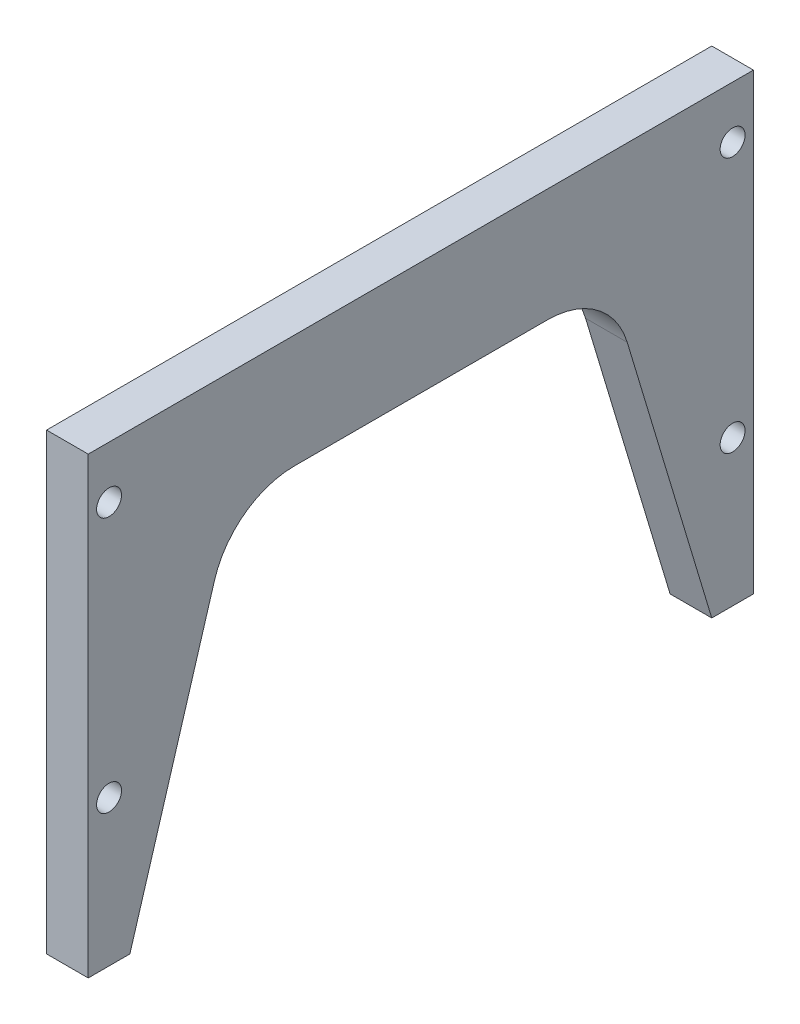
ISO-10303-21;
HEADER;
FILE_DESCRIPTION(('STEP AP214'),'2;1');
FILE_NAME('part.step','',(''),(''),'','','');
FILE_SCHEMA(('AUTOMOTIVE_DESIGN { 1 0 10303 214 1 1 1 1 }'));
ENDSEC;
DATA;
#1=APPLICATION_CONTEXT('core data for automotive mechanical design processes');
#2=APPLICATION_PROTOCOL_DEFINITION('international standard','automotive_design',2000,#1);
#3=PRODUCT_CONTEXT('',#1,'mechanical');
#4=PRODUCT('Part','Part','',(#3));
#5=PRODUCT_RELATED_PRODUCT_CATEGORY('part','',(#4));
#6=PRODUCT_DEFINITION_FORMATION('','',#4);
#7=PRODUCT_DEFINITION_CONTEXT('part definition',#1,'design');
#8=PRODUCT_DEFINITION('design','',#6,#7);
#9=PRODUCT_DEFINITION_SHAPE('','',#8);
#10=(LENGTH_UNIT() NAMED_UNIT(*) SI_UNIT(.MILLI.,.METRE.));
#11=(NAMED_UNIT(*) PLANE_ANGLE_UNIT() SI_UNIT($,.RADIAN.));
#12=(NAMED_UNIT(*) SI_UNIT($,.STERADIAN.) SOLID_ANGLE_UNIT());
#13=UNCERTAINTY_MEASURE_WITH_UNIT(LENGTH_MEASURE(1.E-05),#10,'distance_accuracy_value','');
#14=(GEOMETRIC_REPRESENTATION_CONTEXT(3) GLOBAL_UNCERTAINTY_ASSIGNED_CONTEXT((#13)) GLOBAL_UNIT_ASSIGNED_CONTEXT((#10,
#11,#12)) REPRESENTATION_CONTEXT('',''));
#15=CARTESIAN_POINT('',(0.,0.,0.));
#16=DIRECTION('',(0.,0.,1.));
#17=DIRECTION('',(1.,0.,0.));
#18=AXIS2_PLACEMENT_3D('',#15,#16,#17);
#19=CARTESIAN_POINT('',(-67.2831378268646,-15.875,0.));
#20=DIRECTION('',(0.,1.,0.));
#21=DIRECTION('',(0.,0.,1.));
#22=AXIS2_PLACEMENT_3D('',#19,#20,#21);
#23=PLANE('',#22);
#24=DIRECTION('',(0.,0.,1.));
#25=VECTOR('',#24,1.);
#26=CARTESIAN_POINT('',(-60.9331378268646,-15.875,0.));
#27=LINE('',#26,#25);
#28=CARTESIAN_POINT('',(-60.9331378268646,-15.875,-6.35));
#29=VERTEX_POINT('',#28);
#30=CARTESIAN_POINT('',(-60.9331378268646,-15.875,0.));
#31=VERTEX_POINT('',#30);
#32=EDGE_CURVE('E144',#29,#31,#27,.T.);
#33=ORIENTED_EDGE('',*,*,#32,.T.);
#34=DIRECTION('',(1.,0.,0.));
#35=VECTOR('',#34,1.);
#36=CARTESIAN_POINT('',(-67.2831378268646,-15.875,0.));
#37=LINE('',#36,#35);
#38=CARTESIAN_POINT('',(-67.2831378268646,-15.875,0.));
#39=VERTEX_POINT('',#38);
#40=EDGE_CURVE('E11',#39,#31,#37,.T.);
#41=ORIENTED_EDGE('',*,*,#40,.F.);
#42=DIRECTION('',(0.,0.,1.));
#43=VECTOR('',#42,1.);
#44=CARTESIAN_POINT('',(-67.2831378268646,-15.875,0.));
#45=LINE('',#44,#43);
#46=CARTESIAN_POINT('',(-67.2831378268646,-15.875,-6.35));
#47=VERTEX_POINT('',#46);
#48=EDGE_CURVE('E167',#47,#39,#45,.T.);
#49=ORIENTED_EDGE('',*,*,#48,.F.);
#50=DIRECTION('',(1.,0.,0.));
#51=VECTOR('',#50,1.);
#52=CARTESIAN_POINT('',(-67.2831378268646,-15.875,-6.35));
#53=LINE('',#52,#51);
#54=EDGE_CURVE('E52',#47,#29,#53,.T.);
#55=ORIENTED_EDGE('',*,*,#54,.T.);
#56=EDGE_LOOP('',(#33,#41,#49,#55));
#57=FACE_BOUND('',#56,.T.);
#58=ADVANCED_FACE('F35',(#57),#23,.F.);
#59=CARTESIAN_POINT('',(-67.2831378268646,0.,0.));
#60=DIRECTION('',(0.,0.,-1.));
#61=DIRECTION('',(-1.,0.,0.));
#62=AXIS2_PLACEMENT_3D('',#59,#60,#61);
#63=PLANE('',#62);
#64=DIRECTION('',(0.,1.,0.));
#65=VECTOR('',#64,1.);
#66=CARTESIAN_POINT('',(-60.9331378268646,0.,0.));
#67=LINE('',#66,#65);
#68=CARTESIAN_POINT('',(-60.9331378268646,53.278467801772,0.));
#69=VERTEX_POINT('',#68);
#70=EDGE_CURVE('E146',#31,#69,#67,.T.);
#71=ORIENTED_EDGE('',*,*,#70,.T.);
#72=DIRECTION('',(1.,0.,0.));
#73=VECTOR('',#72,1.);
#74=CARTESIAN_POINT('',(-67.2831378268646,53.278467801772,0.));
#75=LINE('',#74,#73);
#76=CARTESIAN_POINT('',(-67.2831378268646,53.278467801772,0.));
#77=VERTEX_POINT('',#76);
#78=EDGE_CURVE('E44',#77,#69,#75,.T.);
#79=ORIENTED_EDGE('',*,*,#78,.F.);
#80=DIRECTION('',(0.,1.,0.));
#81=VECTOR('',#80,1.);
#82=CARTESIAN_POINT('',(-67.2831378268646,0.,0.));
#83=LINE('',#82,#81);
#84=EDGE_CURVE('E97',#39,#77,#83,.T.);
#85=ORIENTED_EDGE('',*,*,#84,.F.);
#86=ORIENTED_EDGE('',*,*,#40,.T.);
#87=EDGE_LOOP('',(#71,#79,#85,#86));
#88=FACE_BOUND('',#87,.T.);
#89=ADVANCED_FACE('F226',(#88),#63,.F.);
#90=CARTESIAN_POINT('',(-67.2831378268646,53.278467801772,0.));
#91=DIRECTION('',(0.,-1.,0.));
#92=DIRECTION('',(0.,0.,-1.));
#93=AXIS2_PLACEMENT_3D('',#90,#91,#92);
#94=PLANE('',#93);
#95=DIRECTION('',(0.,0.,-1.));
#96=VECTOR('',#95,1.);
#97=CARTESIAN_POINT('',(-60.9331378268646,53.278467801772,0.));
#98=LINE('',#97,#96);
#99=CARTESIAN_POINT('',(-60.9331378268646,53.278467801772,-101.389403682228));
#100=VERTEX_POINT('',#99);
#101=EDGE_CURVE('E149',#69,#100,#98,.T.);
#102=ORIENTED_EDGE('',*,*,#101,.T.);
#103=DIRECTION('',(1.,0.,0.));
#104=VECTOR('',#103,1.);
#105=CARTESIAN_POINT('',(-67.2831378268646,53.278467801772,-101.389403682228));
#106=LINE('',#105,#104);
#107=CARTESIAN_POINT('',(-67.2831378268646,53.278467801772,-101.389403682228));
#108=VERTEX_POINT('',#107);
#109=EDGE_CURVE('E179',#108,#100,#106,.T.);
#110=ORIENTED_EDGE('',*,*,#109,.F.);
#111=DIRECTION('',(0.,0.,-1.));
#112=VECTOR('',#111,1.);
#113=CARTESIAN_POINT('',(-67.2831378268646,53.278467801772,0.));
#114=LINE('',#113,#112);
#115=EDGE_CURVE('E188',#77,#108,#114,.T.);
#116=ORIENTED_EDGE('',*,*,#115,.F.);
#117=ORIENTED_EDGE('',*,*,#78,.T.);
#118=EDGE_LOOP('',(#102,#110,#116,#117));
#119=FACE_BOUND('',#118,.T.);
#120=ADVANCED_FACE('F186',(#119),#94,.F.);
#121=CARTESIAN_POINT('',(-67.2831378268646,0.,-101.389403682228));
#122=DIRECTION('',(0.,0.,1.));
#123=DIRECTION('',(1.,0.,0.));
#124=AXIS2_PLACEMENT_3D('',#121,#122,#123);
#125=PLANE('',#124);
#126=DIRECTION('',(0.,-1.,0.));
#127=VECTOR('',#126,1.);
#128=CARTESIAN_POINT('',(-60.9331378268646,0.,-101.389403682228));
#129=LINE('',#128,#127);
#130=CARTESIAN_POINT('',(-60.9331378268646,-15.875,-101.389403682228));
#131=VERTEX_POINT('',#130);
#132=EDGE_CURVE('E151',#100,#131,#129,.T.);
#133=ORIENTED_EDGE('',*,*,#132,.T.);
#134=DIRECTION('',(1.,0.,0.));
#135=VECTOR('',#134,1.);
#136=CARTESIAN_POINT('',(-67.2831378268646,-15.875,-101.389403682228));
#137=LINE('',#136,#135);
#138=CARTESIAN_POINT('',(-67.2831378268646,-15.875,-101.389403682228));
#139=VERTEX_POINT('',#138);
#140=EDGE_CURVE('E176',#139,#131,#137,.T.);
#141=ORIENTED_EDGE('',*,*,#140,.F.);
#142=DIRECTION('',(0.,-1.,0.));
#143=VECTOR('',#142,1.);
#144=CARTESIAN_POINT('',(-67.2831378268646,0.,-101.389403682228));
#145=LINE('',#144,#143);
#146=EDGE_CURVE('E205',#108,#139,#145,.T.);
#147=ORIENTED_EDGE('',*,*,#146,.F.);
#148=ORIENTED_EDGE('',*,*,#109,.T.);
#149=EDGE_LOOP('',(#133,#141,#147,#148));
#150=FACE_BOUND('',#149,.T.);
#151=ADVANCED_FACE('F196',(#150),#125,.F.);
#152=CARTESIAN_POINT('',(-67.2831378268646,-15.875,0.));
#153=DIRECTION('',(0.,1.,0.));
#154=DIRECTION('',(0.,0.,1.));
#155=AXIS2_PLACEMENT_3D('',#152,#153,#154);
#156=PLANE('',#155);
#157=DIRECTION('',(0.,0.,1.));
#158=VECTOR('',#157,1.);
#159=CARTESIAN_POINT('',(-60.9331378268646,-15.875,0.));
#160=LINE('',#159,#158);
#161=CARTESIAN_POINT('',(-60.9331378268646,-15.875,-95.0394036822282));
#162=VERTEX_POINT('',#161);
#163=EDGE_CURVE('E153',#131,#162,#160,.T.);
#164=ORIENTED_EDGE('',*,*,#163,.T.);
#165=DIRECTION('',(1.,0.,0.));
#166=VECTOR('',#165,1.);
#167=CARTESIAN_POINT('',(-67.2831378268646,-15.875,-95.0394036822282));
#168=LINE('',#167,#166);
#169=CARTESIAN_POINT('',(-67.2831378268646,-15.875,-95.0394036822282));
#170=VERTEX_POINT('',#169);
#171=EDGE_CURVE('E173',#170,#162,#168,.T.);
#172=ORIENTED_EDGE('',*,*,#171,.F.);
#173=DIRECTION('',(0.,0.,1.));
#174=VECTOR('',#173,1.);
#175=CARTESIAN_POINT('',(-67.2831378268646,-15.875,0.));
#176=LINE('',#175,#174);
#177=EDGE_CURVE('E202',#139,#170,#176,.T.);
#178=ORIENTED_EDGE('',*,*,#177,.F.);
#179=ORIENTED_EDGE('',*,*,#140,.T.);
#180=EDGE_LOOP('',(#164,#172,#178,#179));
#181=FACE_BOUND('',#180,.T.);
#182=ADVANCED_FACE('F200',(#181),#156,.F.);
#183=CARTESIAN_POINT('',(-67.2831378268646,24.8989950156883,-82.7743549297925));
#184=DIRECTION('',(0.,0.288055621235218,-0.957613679452624));
#185=DIRECTION('',(0.,0.957613679452624,0.288055621235218));
#186=AXIS2_PLACEMENT_3D('',#183,#184,#185);
#187=PLANE('',#186);
#188=DIRECTION('',(0.,0.957613679452624,0.288055621235218));
#189=VECTOR('',#188,1.);
#190=CARTESIAN_POINT('',(-60.9331378268646,24.8989950156883,-82.7743549297925));
#191=LINE('',#190,#189);
#192=CARTESIAN_POINT('',(-60.9331378268646,26.9601430789718,-82.1543499125644));
#193=VERTEX_POINT('',#192);
#194=EDGE_CURVE('E155',#162,#193,#191,.T.);
#195=ORIENTED_EDGE('',*,*,#194,.T.);
#196=DIRECTION('',(1.,0.,0.));
#197=VECTOR('',#196,1.);
#198=CARTESIAN_POINT('',(-67.2831378268646,26.9601430789718,-82.1543499125644));
#199=LINE('',#198,#197);
#200=CARTESIAN_POINT('',(-67.2831378268646,26.9601430789718,-82.1543499125644));
#201=VERTEX_POINT('',#200);
#202=EDGE_CURVE('E171',#201,#193,#199,.T.);
#203=ORIENTED_EDGE('',*,*,#202,.F.);
#204=DIRECTION('',(0.,0.957613679452624,0.288055621235218));
#205=VECTOR('',#204,1.);
#206=CARTESIAN_POINT('',(-67.2831378268646,24.8989950156883,-82.7743549297925));
#207=LINE('',#206,#205);
#208=EDGE_CURVE('E204',#170,#201,#207,.T.);
#209=ORIENTED_EDGE('',*,*,#208,.F.);
#210=ORIENTED_EDGE('',*,*,#171,.T.);
#211=EDGE_LOOP('',(#195,#203,#209,#210));
#212=FACE_BOUND('',#211,.T.);
#213=ADVANCED_FACE('F345',(#212),#187,.F.);
#214=CARTESIAN_POINT('',(-67.2831378268646,23.3018366892845,-69.9926561835161));
#215=DIRECTION('',(1.,0.,0.));
#216=DIRECTION('',(0.,0.,-1.));
#217=AXIS2_PLACEMENT_3D('',#214,#215,#216);
#218=CYLINDRICAL_SURFACE('',#217,12.7);
#219=CARTESIAN_POINT('',(-60.9331378268646,23.3018366892845,-69.9926561835161));
#220=DIRECTION('',(-1.,0.,0.));
#221=DIRECTION('',(0.,0.,1.));
#222=AXIS2_PLACEMENT_3D('',#219,#220,#221);
#223=CIRCLE('',#222,12.7);
#224=CARTESIAN_POINT('',(-60.9331378268646,36.0018366892845,-69.9926561835161));
#225=VERTEX_POINT('',#224);
#226=EDGE_CURVE('E158',#225,#193,#223,.T.);
#227=ORIENTED_EDGE('',*,*,#226,.F.);
#228=DIRECTION('',(1.,0.,0.));
#229=VECTOR('',#228,1.);
#230=CARTESIAN_POINT('',(-67.2831378268646,36.0018366892845,-69.9926561835161));
#231=LINE('',#230,#229);
#232=CARTESIAN_POINT('',(-67.2831378268646,36.0018366892845,-69.9926561835161));
#233=VERTEX_POINT('',#232);
#234=EDGE_CURVE('E136',#233,#225,#231,.T.);
#235=ORIENTED_EDGE('',*,*,#234,.F.);
#236=CARTESIAN_POINT('',(-67.2831378268646,23.3018366892845,-69.9926561835161));
#237=DIRECTION('',(-1.,0.,0.));
#238=DIRECTION('',(0.,0.,1.));
#239=AXIS2_PLACEMENT_3D('',#236,#237,#238);
#240=CIRCLE('',#239,12.7);
#241=EDGE_CURVE('E126',#233,#201,#240,.T.);
#242=ORIENTED_EDGE('',*,*,#241,.T.);
#243=ORIENTED_EDGE('',*,*,#202,.T.);
#244=EDGE_LOOP('',(#227,#235,#242,#243));
#245=FACE_BOUND('',#244,.T.);
#246=ADVANCED_FACE('F212',(#245),#218,.F.);
#247=CARTESIAN_POINT('',(-67.2831378268646,36.0018366892845,0.));
#248=DIRECTION('',(0.,1.,0.));
#249=DIRECTION('',(0.,0.,1.));
#250=AXIS2_PLACEMENT_3D('',#247,#248,#249);
#251=PLANE('',#250);
#252=DIRECTION('',(0.,0.,1.));
#253=VECTOR('',#252,1.);
#254=CARTESIAN_POINT('',(-60.9331378268646,36.0018366892845,0.));
#255=LINE('',#254,#253);
#256=CARTESIAN_POINT('',(-60.9331378268646,36.0018366892845,-31.3967474987121));
#257=VERTEX_POINT('',#256);
#258=EDGE_CURVE('E133',#225,#257,#255,.T.);
#259=ORIENTED_EDGE('',*,*,#258,.T.);
#260=DIRECTION('',(1.,0.,0.));
#261=VECTOR('',#260,1.);
#262=CARTESIAN_POINT('',(-67.2831378268646,36.0018366892845,-31.3967474987121));
#263=LINE('',#262,#261);
#264=CARTESIAN_POINT('',(-67.2831378268646,36.0018366892845,-31.3967474987121));
#265=VERTEX_POINT('',#264);
#266=EDGE_CURVE('E130',#265,#257,#263,.T.);
#267=ORIENTED_EDGE('',*,*,#266,.F.);
#268=DIRECTION('',(0.,0.,1.));
#269=VECTOR('',#268,1.);
#270=CARTESIAN_POINT('',(-67.2831378268646,36.0018366892845,0.));
#271=LINE('',#270,#269);
#272=EDGE_CURVE('E119',#233,#265,#271,.T.);
#273=ORIENTED_EDGE('',*,*,#272,.F.);
#274=ORIENTED_EDGE('',*,*,#234,.T.);
#275=EDGE_LOOP('',(#259,#267,#273,#274));
#276=FACE_BOUND('',#275,.T.);
#277=ADVANCED_FACE('F131',(#276),#251,.F.);
#278=CARTESIAN_POINT('',(-67.2831378268646,23.3018366892845,-31.3967474987121));
#279=DIRECTION('',(1.,0.,0.));
#280=DIRECTION('',(0.,0.,-1.));
#281=AXIS2_PLACEMENT_3D('',#278,#279,#280);
#282=CYLINDRICAL_SURFACE('',#281,12.7);
#283=CARTESIAN_POINT('',(-60.9331378268646,23.3018366892845,-31.3967474987121));
#284=DIRECTION('',(-1.,0.,0.));
#285=DIRECTION('',(0.,0.,1.));
#286=AXIS2_PLACEMENT_3D('',#283,#284,#285);
#287=CIRCLE('',#286,12.7);
#288=CARTESIAN_POINT('',(-60.9331378268646,26.9601430789718,-19.2350537696638));
#289=VERTEX_POINT('',#288);
#290=EDGE_CURVE('E162',#257,#289,#287,.F.);
#291=ORIENTED_EDGE('',*,*,#290,.T.);
#292=DIRECTION('',(1.,0.,0.));
#293=VECTOR('',#292,1.);
#294=CARTESIAN_POINT('',(-67.2831378268646,26.9601430789718,-19.2350537696638));
#295=LINE('',#294,#293);
#296=CARTESIAN_POINT('',(-67.2831378268646,26.9601430789718,-19.2350537696638));
#297=VERTEX_POINT('',#296);
#298=EDGE_CURVE('E85',#297,#289,#295,.T.);
#299=ORIENTED_EDGE('',*,*,#298,.F.);
#300=CARTESIAN_POINT('',(-67.2831378268646,23.3018366892845,-31.3967474987121));
#301=DIRECTION('',(-1.,0.,0.));
#302=DIRECTION('',(0.,0.,1.));
#303=AXIS2_PLACEMENT_3D('',#300,#301,#302);
#304=CIRCLE('',#303,12.7);
#305=EDGE_CURVE('E124',#265,#297,#304,.F.);
#306=ORIENTED_EDGE('',*,*,#305,.F.);
#307=ORIENTED_EDGE('',*,*,#266,.T.);
#308=EDGE_LOOP('',(#291,#299,#306,#307));
#309=FACE_BOUND('',#308,.T.);
#310=ADVANCED_FACE('F138',(#309),#282,.F.);
#311=CARTESIAN_POINT('',(-67.2831378268646,-3.06886677088441,-10.2021574431168));
#312=DIRECTION('',(0.,-0.288055621235218,-0.957613679452624));
#313=DIRECTION('',(0.,0.957613679452624,-0.288055621235218));
#314=AXIS2_PLACEMENT_3D('',#311,#312,#313);
#315=PLANE('',#314);
#316=DIRECTION('',(0.,0.957613679452624,-0.288055621235218));
#317=VECTOR('',#316,1.);
#318=CARTESIAN_POINT('',(-60.9331378268646,-3.06886677088441,-10.2021574431168));
#319=LINE('',#318,#317);
#320=EDGE_CURVE('E164',#29,#289,#319,.T.);
#321=ORIENTED_EDGE('',*,*,#320,.F.);
#322=ORIENTED_EDGE('',*,*,#54,.F.);
#323=DIRECTION('',(0.,0.957613679452624,-0.288055621235218));
#324=VECTOR('',#323,1.);
#325=CARTESIAN_POINT('',(-67.2831378268646,-3.06886677088441,-10.2021574431168));
#326=LINE('',#325,#324);
#327=EDGE_CURVE('E139',#47,#297,#326,.T.);
#328=ORIENTED_EDGE('',*,*,#327,.T.);
#329=ORIENTED_EDGE('',*,*,#298,.T.);
#330=EDGE_LOOP('',(#321,#322,#328,#329));
#331=FACE_BOUND('',#330,.T.);
#332=ADVANCED_FACE('F214',(#331),#315,.T.);
#333=CARTESIAN_POINT('',(-67.2831378268646,0.,0.));
#334=DIRECTION('',(-1.,0.,0.));
#335=DIRECTION('',(0.,0.,1.));
#336=AXIS2_PLACEMENT_3D('',#333,#334,#335);
#337=PLANE('',#336);
#338=CARTESIAN_POINT('',(-67.2831378268646,45.340967801772,-3.175));
#339=DIRECTION('',(-1.,0.,0.));
#340=DIRECTION('',(0.,0.,1.));
#341=AXIS2_PLACEMENT_3D('',#338,#339,#340);
#342=CIRCLE('',#341,1.89865);
#343=CARTESIAN_POINT('',(-67.2831378268646,45.340967801772,-1.27635));
#344=VERTEX_POINT('',#343);
#345=EDGE_CURVE('E251',#344,#344,#342,.T.);
#346=ORIENTED_EDGE('',*,*,#345,.F.);
#347=EDGE_LOOP('',(#346));
#348=FACE_BOUND('',#347,.T.);
#349=CARTESIAN_POINT('',(-67.2831378268646,6.35,-3.175));
#350=DIRECTION('',(-1.,0.,0.));
#351=DIRECTION('',(0.,0.,1.));
#352=AXIS2_PLACEMENT_3D('',#349,#350,#351);
#353=CIRCLE('',#352,1.89865);
#354=CARTESIAN_POINT('',(-67.2831378268646,6.35,-1.27635));
#355=VERTEX_POINT('',#354);
#356=EDGE_CURVE('E248',#355,#355,#353,.T.);
#357=ORIENTED_EDGE('',*,*,#356,.F.);
#358=EDGE_LOOP('',(#357));
#359=FACE_BOUND('',#358,.T.);
#360=CARTESIAN_POINT('',(-67.2831378268646,6.35,-98.2144036822282));
#361=DIRECTION('',(-1.,0.,0.));
#362=DIRECTION('',(0.,0.,1.));
#363=AXIS2_PLACEMENT_3D('',#360,#361,#362);
#364=CIRCLE('',#363,1.89865);
#365=CARTESIAN_POINT('',(-67.2831378268646,6.35,-96.3157536822282));
#366=VERTEX_POINT('',#365);
#367=EDGE_CURVE('E242',#366,#366,#364,.T.);
#368=ORIENTED_EDGE('',*,*,#367,.F.);
#369=EDGE_LOOP('',(#368));
#370=FACE_BOUND('',#369,.T.);
#371=CARTESIAN_POINT('',(-67.2831378268646,45.340967801772,-98.2144036822282));
#372=DIRECTION('',(-1.,0.,0.));
#373=DIRECTION('',(0.,0.,1.));
#374=AXIS2_PLACEMENT_3D('',#371,#372,#373);
#375=CIRCLE('',#374,1.89865);
#376=CARTESIAN_POINT('',(-67.2831378268646,45.340967801772,-96.3157536822282));
#377=VERTEX_POINT('',#376);
#378=EDGE_CURVE('E236',#377,#377,#375,.T.);
#379=ORIENTED_EDGE('',*,*,#378,.F.);
#380=EDGE_LOOP('',(#379));
#381=FACE_BOUND('',#380,.T.);
#382=ORIENTED_EDGE('',*,*,#48,.T.);
#383=ORIENTED_EDGE('',*,*,#84,.T.);
#384=ORIENTED_EDGE('',*,*,#115,.T.);
#385=ORIENTED_EDGE('',*,*,#146,.T.);
#386=ORIENTED_EDGE('',*,*,#177,.T.);
#387=ORIENTED_EDGE('',*,*,#208,.T.);
#388=ORIENTED_EDGE('',*,*,#241,.F.);
#389=ORIENTED_EDGE('',*,*,#272,.T.);
#390=ORIENTED_EDGE('',*,*,#305,.T.);
#391=ORIENTED_EDGE('',*,*,#327,.F.);
#392=EDGE_LOOP('',(#382,#383,#384,#385,#386,#387,#388,#389,#390,#391));
#393=FACE_BOUND('',#392,.T.);
#394=ADVANCED_FACE('F121',(#348,#359,#370,#381,#393),#337,.T.);
#395=CARTESIAN_POINT('',(-60.9331378268646,0.,0.));
#396=DIRECTION('',(-1.,0.,0.));
#397=DIRECTION('',(0.,0.,1.));
#398=AXIS2_PLACEMENT_3D('',#395,#396,#397);
#399=PLANE('',#398);
#400=CARTESIAN_POINT('',(-60.9331378268646,45.340967801772,-3.175));
#401=DIRECTION('',(-1.,0.,0.));
#402=DIRECTION('',(0.,0.,1.));
#403=AXIS2_PLACEMENT_3D('',#400,#401,#402);
#404=CIRCLE('',#403,1.89865);
#405=CARTESIAN_POINT('',(-60.9331378268646,45.340967801772,-1.27635));
#406=VERTEX_POINT('',#405);
#407=EDGE_CURVE('E38',#406,#406,#404,.T.);
#408=ORIENTED_EDGE('',*,*,#407,.T.);
#409=EDGE_LOOP('',(#408));
#410=FACE_BOUND('',#409,.T.);
#411=CARTESIAN_POINT('',(-60.9331378268646,6.35,-3.175));
#412=DIRECTION('',(-1.,0.,0.));
#413=DIRECTION('',(0.,0.,1.));
#414=AXIS2_PLACEMENT_3D('',#411,#412,#413);
#415=CIRCLE('',#414,1.89865);
#416=CARTESIAN_POINT('',(-60.9331378268646,6.35,-1.27635));
#417=VERTEX_POINT('',#416);
#418=EDGE_CURVE('E245',#417,#417,#415,.T.);
#419=ORIENTED_EDGE('',*,*,#418,.T.);
#420=EDGE_LOOP('',(#419));
#421=FACE_BOUND('',#420,.T.);
#422=CARTESIAN_POINT('',(-60.9331378268646,6.35,-98.2144036822282));
#423=DIRECTION('',(-1.,0.,0.));
#424=DIRECTION('',(0.,0.,1.));
#425=AXIS2_PLACEMENT_3D('',#422,#423,#424);
#426=CIRCLE('',#425,1.89865);
#427=CARTESIAN_POINT('',(-60.9331378268646,6.35,-96.3157536822282));
#428=VERTEX_POINT('',#427);
#429=EDGE_CURVE('E239',#428,#428,#426,.T.);
#430=ORIENTED_EDGE('',*,*,#429,.T.);
#431=EDGE_LOOP('',(#430));
#432=FACE_BOUND('',#431,.T.);
#433=CARTESIAN_POINT('',(-60.9331378268646,45.340967801772,-98.2144036822282));
#434=DIRECTION('',(-1.,0.,0.));
#435=DIRECTION('',(0.,0.,1.));
#436=AXIS2_PLACEMENT_3D('',#433,#434,#435);
#437=CIRCLE('',#436,1.89865);
#438=CARTESIAN_POINT('',(-60.9331378268646,45.340967801772,-96.3157536822282));
#439=VERTEX_POINT('',#438);
#440=EDGE_CURVE('E147',#439,#439,#437,.T.);
#441=ORIENTED_EDGE('',*,*,#440,.T.);
#442=EDGE_LOOP('',(#441));
#443=FACE_BOUND('',#442,.T.);
#444=ORIENTED_EDGE('',*,*,#32,.F.);
#445=ORIENTED_EDGE('',*,*,#320,.T.);
#446=ORIENTED_EDGE('',*,*,#290,.F.);
#447=ORIENTED_EDGE('',*,*,#258,.F.);
#448=ORIENTED_EDGE('',*,*,#226,.T.);
#449=ORIENTED_EDGE('',*,*,#194,.F.);
#450=ORIENTED_EDGE('',*,*,#163,.F.);
#451=ORIENTED_EDGE('',*,*,#132,.F.);
#452=ORIENTED_EDGE('',*,*,#101,.F.);
#453=ORIENTED_EDGE('',*,*,#70,.F.);
#454=EDGE_LOOP('',(#444,#445,#446,#447,#448,#449,#450,#451,#452,#453));
#455=FACE_BOUND('',#454,.T.);
#456=ADVANCED_FACE('F191',(#410,#421,#432,#443,#455),#399,.F.);
#457=CARTESIAN_POINT('',(-67.2831378268646,45.340967801772,-98.2144036822282));
#458=DIRECTION('',(-1.,0.,0.));
#459=DIRECTION('',(0.,0.,1.));
#460=AXIS2_PLACEMENT_3D('',#457,#458,#459);
#461=CYLINDRICAL_SURFACE('',#460,1.89865);
#462=ORIENTED_EDGE('',*,*,#378,.T.);
#463=EDGE_LOOP('',(#462));
#464=FACE_BOUND('',#463,.T.);
#465=ORIENTED_EDGE('',*,*,#440,.F.);
#466=EDGE_LOOP('',(#465));
#467=FACE_BOUND('',#466,.T.);
#468=ADVANCED_FACE('F273',(#464,#467),#461,.F.);
#469=CARTESIAN_POINT('',(-67.2831378268646,6.35,-98.2144036822282));
#470=DIRECTION('',(-1.,0.,0.));
#471=DIRECTION('',(0.,0.,1.));
#472=AXIS2_PLACEMENT_3D('',#469,#470,#471);
#473=CYLINDRICAL_SURFACE('',#472,1.89865);
#474=ORIENTED_EDGE('',*,*,#367,.T.);
#475=EDGE_LOOP('',(#474));
#476=FACE_BOUND('',#475,.T.);
#477=ORIENTED_EDGE('',*,*,#429,.F.);
#478=EDGE_LOOP('',(#477));
#479=FACE_BOUND('',#478,.T.);
#480=ADVANCED_FACE('F267',(#476,#479),#473,.F.);
#481=CARTESIAN_POINT('',(-67.2831378268646,6.35,-3.175));
#482=DIRECTION('',(-1.,0.,0.));
#483=DIRECTION('',(0.,0.,1.));
#484=AXIS2_PLACEMENT_3D('',#481,#482,#483);
#485=CYLINDRICAL_SURFACE('',#484,1.89865);
#486=ORIENTED_EDGE('',*,*,#356,.T.);
#487=EDGE_LOOP('',(#486));
#488=FACE_BOUND('',#487,.T.);
#489=ORIENTED_EDGE('',*,*,#418,.F.);
#490=EDGE_LOOP('',(#489));
#491=FACE_BOUND('',#490,.T.);
#492=ADVANCED_FACE('F262',(#488,#491),#485,.F.);
#493=CARTESIAN_POINT('',(-67.2831378268646,45.340967801772,-3.175));
#494=DIRECTION('',(-1.,0.,0.));
#495=DIRECTION('',(0.,0.,1.));
#496=AXIS2_PLACEMENT_3D('',#493,#494,#495);
#497=CYLINDRICAL_SURFACE('',#496,1.89865);
#498=ORIENTED_EDGE('',*,*,#345,.T.);
#499=EDGE_LOOP('',(#498));
#500=FACE_BOUND('',#499,.T.);
#501=ORIENTED_EDGE('',*,*,#407,.F.);
#502=EDGE_LOOP('',(#501));
#503=FACE_BOUND('',#502,.T.);
#504=ADVANCED_FACE('F260',(#500,#503),#497,.F.);
#505=CLOSED_SHELL('',(#58,#89,#120,#151,#182,#213,#246,#277,#310,#332,#394,#456,#468,#480,#492,#504));
#506=MANIFOLD_SOLID_BREP('B2',#505);
#507=ADVANCED_BREP_SHAPE_REPRESENTATION('',(#18,#506),#14);
#508=SHAPE_DEFINITION_REPRESENTATION(#9,#507);
ENDSEC;
END-ISO-10303-21;
